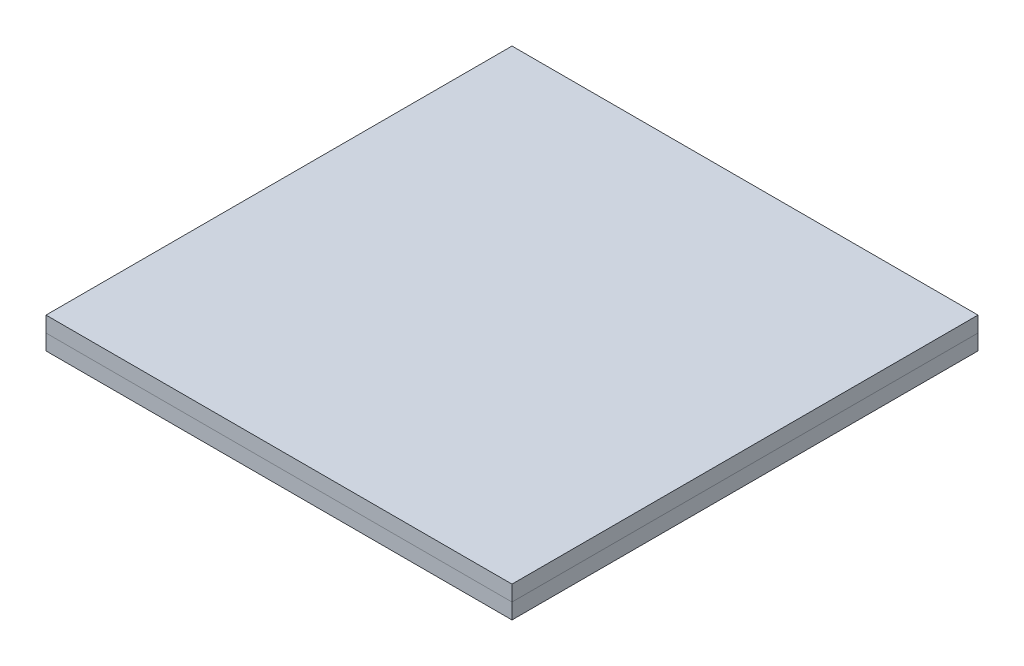
ISO-10303-21;
HEADER;
FILE_DESCRIPTION(('STEP AP214'),'2;1');
FILE_NAME('part.step','',(''),(''),'','','');
FILE_SCHEMA(('AUTOMOTIVE_DESIGN { 1 0 10303 214 1 1 1 1 }'));
ENDSEC;
DATA;
#1=APPLICATION_CONTEXT('core data for automotive mechanical design processes');
#2=APPLICATION_PROTOCOL_DEFINITION('international standard','automotive_design',2000,#1);
#3=PRODUCT_CONTEXT('',#1,'mechanical');
#4=PRODUCT('Part','Part','',(#3));
#5=PRODUCT_RELATED_PRODUCT_CATEGORY('part','',(#4));
#6=PRODUCT_DEFINITION_FORMATION('','',#4);
#7=PRODUCT_DEFINITION_CONTEXT('part definition',#1,'design');
#8=PRODUCT_DEFINITION('design','',#6,#7);
#9=PRODUCT_DEFINITION_SHAPE('','',#8);
#10=(LENGTH_UNIT() NAMED_UNIT(*) SI_UNIT(.MILLI.,.METRE.));
#11=(NAMED_UNIT(*) PLANE_ANGLE_UNIT() SI_UNIT($,.RADIAN.));
#12=(NAMED_UNIT(*) SI_UNIT($,.STERADIAN.) SOLID_ANGLE_UNIT());
#13=UNCERTAINTY_MEASURE_WITH_UNIT(LENGTH_MEASURE(1.E-05),#10,'distance_accuracy_value','');
#14=(GEOMETRIC_REPRESENTATION_CONTEXT(3) GLOBAL_UNCERTAINTY_ASSIGNED_CONTEXT((#13)) GLOBAL_UNIT_ASSIGNED_CONTEXT((#10,
#11,#12)) REPRESENTATION_CONTEXT('',''));
#15=CARTESIAN_POINT('',(0.,0.,0.));
#16=DIRECTION('',(0.,0.,1.));
#17=DIRECTION('',(1.,0.,0.));
#18=AXIS2_PLACEMENT_3D('',#15,#16,#17);
#19=CARTESIAN_POINT('',(0.,1.27,0.));
#20=DIRECTION('',(0.,-1.,0.));
#21=DIRECTION('',(0.,0.,-1.));
#22=AXIS2_PLACEMENT_3D('',#19,#20,#21);
#23=PLANE('',#22);
#24=DIRECTION('',(1.,0.,0.));
#25=VECTOR('',#24,1.);
#26=CARTESIAN_POINT('',(-19.05,1.27,-19.05));
#27=LINE('',#26,#25);
#28=CARTESIAN_POINT('',(-19.05,1.27,-19.05));
#29=VERTEX_POINT('',#28);
#30=CARTESIAN_POINT('',(19.05,1.27,-19.05));
#31=VERTEX_POINT('',#30);
#32=EDGE_CURVE('E113',#29,#31,#27,.T.);
#33=ORIENTED_EDGE('',*,*,#32,.T.);
#34=DIRECTION('',(0.,0.,1.));
#35=VECTOR('',#34,1.);
#36=CARTESIAN_POINT('',(19.05,1.27,19.05));
#37=LINE('',#36,#35);
#38=CARTESIAN_POINT('',(19.05,1.27,19.05));
#39=VERTEX_POINT('',#38);
#40=EDGE_CURVE('E100',#31,#39,#37,.T.);
#41=ORIENTED_EDGE('',*,*,#40,.T.);
#42=DIRECTION('',(-1.,0.,0.));
#43=VECTOR('',#42,1.);
#44=CARTESIAN_POINT('',(-19.05,1.27,19.05));
#45=LINE('',#44,#43);
#46=CARTESIAN_POINT('',(-19.05,1.27,19.05));
#47=VERTEX_POINT('',#46);
#48=EDGE_CURVE('E111',#39,#47,#45,.T.);
#49=ORIENTED_EDGE('',*,*,#48,.T.);
#50=DIRECTION('',(0.,0.,-1.));
#51=VECTOR('',#50,1.);
#52=CARTESIAN_POINT('',(-19.05,1.27,19.05));
#53=LINE('',#52,#51);
#54=EDGE_CURVE('E120',#47,#29,#53,.T.);
#55=ORIENTED_EDGE('',*,*,#54,.T.);
#56=EDGE_LOOP('',(#33,#41,#49,#55));
#57=FACE_BOUND('',#56,.T.);
#58=ADVANCED_FACE('F57',(#57),#23,.T.);
#59=CARTESIAN_POINT('',(19.05,2.54,19.05));
#60=DIRECTION('',(-1.,0.,0.));
#61=DIRECTION('',(0.,0.,1.));
#62=AXIS2_PLACEMENT_3D('',#59,#60,#61);
#63=PLANE('',#62);
#64=ORIENTED_EDGE('',*,*,#40,.F.);
#65=DIRECTION('',(0.,-1.,0.));
#66=VECTOR('',#65,1.);
#67=CARTESIAN_POINT('',(19.05,2.54,-19.05));
#68=LINE('',#67,#66);
#69=CARTESIAN_POINT('',(19.05,2.54,-19.05));
#70=VERTEX_POINT('',#69);
#71=EDGE_CURVE('E115',#70,#31,#68,.T.);
#72=ORIENTED_EDGE('',*,*,#71,.F.);
#73=DIRECTION('',(0.,0.,-1.));
#74=VECTOR('',#73,1.);
#75=CARTESIAN_POINT('',(19.05,2.54,19.05));
#76=LINE('',#75,#74);
#77=CARTESIAN_POINT('',(19.05,2.54,19.05));
#78=VERTEX_POINT('',#77);
#79=EDGE_CURVE('E12',#78,#70,#76,.T.);
#80=ORIENTED_EDGE('',*,*,#79,.F.);
#81=DIRECTION('',(0.,-1.,0.));
#82=VECTOR('',#81,1.);
#83=CARTESIAN_POINT('',(19.05,2.54,19.05));
#84=LINE('',#83,#82);
#85=EDGE_CURVE('E61',#78,#39,#84,.T.);
#86=ORIENTED_EDGE('',*,*,#85,.T.);
#87=EDGE_LOOP('',(#64,#72,#80,#86));
#88=FACE_BOUND('',#87,.T.);
#89=ADVANCED_FACE('F98',(#88),#63,.F.);
#90=CARTESIAN_POINT('',(-19.05,2.54,-19.05));
#91=DIRECTION('',(0.,0.,1.));
#92=DIRECTION('',(1.,0.,0.));
#93=AXIS2_PLACEMENT_3D('',#90,#91,#92);
#94=PLANE('',#93);
#95=ORIENTED_EDGE('',*,*,#32,.F.);
#96=DIRECTION('',(0.,-1.,0.));
#97=VECTOR('',#96,1.);
#98=CARTESIAN_POINT('',(-19.05,2.54,-19.05));
#99=LINE('',#98,#97);
#100=CARTESIAN_POINT('',(-19.05,2.54,-19.05));
#101=VERTEX_POINT('',#100);
#102=EDGE_CURVE('E128',#101,#29,#99,.T.);
#103=ORIENTED_EDGE('',*,*,#102,.F.);
#104=DIRECTION('',(-1.,0.,0.));
#105=VECTOR('',#104,1.);
#106=CARTESIAN_POINT('',(-19.05,2.54,-19.05));
#107=LINE('',#106,#105);
#108=EDGE_CURVE('E67',#70,#101,#107,.T.);
#109=ORIENTED_EDGE('',*,*,#108,.F.);
#110=ORIENTED_EDGE('',*,*,#71,.T.);
#111=EDGE_LOOP('',(#95,#103,#109,#110));
#112=FACE_BOUND('',#111,.T.);
#113=ADVANCED_FACE('F143',(#112),#94,.F.);
#114=CARTESIAN_POINT('',(-19.05,2.54,19.05));
#115=DIRECTION('',(1.,0.,0.));
#116=DIRECTION('',(0.,0.,-1.));
#117=AXIS2_PLACEMENT_3D('',#114,#115,#116);
#118=PLANE('',#117);
#119=ORIENTED_EDGE('',*,*,#54,.F.);
#120=DIRECTION('',(0.,-1.,0.));
#121=VECTOR('',#120,1.);
#122=CARTESIAN_POINT('',(-19.05,2.54,19.05));
#123=LINE('',#122,#121);
#124=CARTESIAN_POINT('',(-19.05,2.54,19.05));
#125=VERTEX_POINT('',#124);
#126=EDGE_CURVE('E107',#125,#47,#123,.T.);
#127=ORIENTED_EDGE('',*,*,#126,.F.);
#128=DIRECTION('',(0.,0.,1.));
#129=VECTOR('',#128,1.);
#130=CARTESIAN_POINT('',(-19.05,2.54,19.05));
#131=LINE('',#130,#129);
#132=EDGE_CURVE('E136',#101,#125,#131,.T.);
#133=ORIENTED_EDGE('',*,*,#132,.F.);
#134=ORIENTED_EDGE('',*,*,#102,.T.);
#135=EDGE_LOOP('',(#119,#127,#133,#134));
#136=FACE_BOUND('',#135,.T.);
#137=ADVANCED_FACE('F142',(#136),#118,.F.);
#138=CARTESIAN_POINT('',(-19.05,2.54,19.05));
#139=DIRECTION('',(0.,0.,-1.));
#140=DIRECTION('',(-1.,0.,0.));
#141=AXIS2_PLACEMENT_3D('',#138,#139,#140);
#142=PLANE('',#141);
#143=ORIENTED_EDGE('',*,*,#48,.F.);
#144=ORIENTED_EDGE('',*,*,#85,.F.);
#145=DIRECTION('',(1.,0.,0.));
#146=VECTOR('',#145,1.);
#147=CARTESIAN_POINT('',(-19.05,2.54,19.05));
#148=LINE('',#147,#146);
#149=EDGE_CURVE('E106',#125,#78,#148,.T.);
#150=ORIENTED_EDGE('',*,*,#149,.F.);
#151=ORIENTED_EDGE('',*,*,#126,.T.);
#152=EDGE_LOOP('',(#143,#144,#150,#151));
#153=FACE_BOUND('',#152,.T.);
#154=ADVANCED_FACE('F59',(#153),#142,.F.);
#155=CARTESIAN_POINT('',(0.,2.54,0.));
#156=DIRECTION('',(0.,-1.,0.));
#157=DIRECTION('',(0.,0.,-1.));
#158=AXIS2_PLACEMENT_3D('',#155,#156,#157);
#159=PLANE('',#158);
#160=ORIENTED_EDGE('',*,*,#79,.T.);
#161=ORIENTED_EDGE('',*,*,#108,.T.);
#162=ORIENTED_EDGE('',*,*,#132,.T.);
#163=ORIENTED_EDGE('',*,*,#149,.T.);
#164=EDGE_LOOP('',(#160,#161,#162,#163));
#165=FACE_BOUND('',#164,.T.);
#166=ADVANCED_FACE('F139',(#165),#159,.F.);
#167=CLOSED_SHELL('',(#58,#89,#113,#137,#154,#166));
#168=MANIFOLD_SOLID_BREP('B2',#167);
#169=CARTESIAN_POINT('',(0.,1.27,0.));
#170=DIRECTION('',(0.,-1.,0.));
#171=DIRECTION('',(0.,0.,-1.));
#172=AXIS2_PLACEMENT_3D('',#169,#170,#171);
#173=PLANE('',#172);
#174=DIRECTION('',(1.,0.,0.));
#175=VECTOR('',#174,1.);
#176=CARTESIAN_POINT('',(-19.05,1.27,-19.05));
#177=LINE('',#176,#175);
#178=CARTESIAN_POINT('',(-19.05,1.27,-19.05));
#179=VERTEX_POINT('',#178);
#180=CARTESIAN_POINT('',(19.05,1.27,-19.05));
#181=VERTEX_POINT('',#180);
#182=EDGE_CURVE('E219',#179,#181,#177,.T.);
#183=ORIENTED_EDGE('',*,*,#182,.F.);
#184=DIRECTION('',(0.,0.,-1.));
#185=VECTOR('',#184,1.);
#186=CARTESIAN_POINT('',(-19.05,1.27,19.05));
#187=LINE('',#186,#185);
#188=CARTESIAN_POINT('',(-19.05,1.27,19.05));
#189=VERTEX_POINT('',#188);
#190=EDGE_CURVE('E232',#189,#179,#187,.T.);
#191=ORIENTED_EDGE('',*,*,#190,.F.);
#192=DIRECTION('',(-1.,0.,0.));
#193=VECTOR('',#192,1.);
#194=CARTESIAN_POINT('',(-19.05,1.27,19.05));
#195=LINE('',#194,#193);
#196=CARTESIAN_POINT('',(19.05,1.27,19.05));
#197=VERTEX_POINT('',#196);
#198=EDGE_CURVE('E259',#197,#189,#195,.T.);
#199=ORIENTED_EDGE('',*,*,#198,.F.);
#200=DIRECTION('',(0.,0.,1.));
#201=VECTOR('',#200,1.);
#202=CARTESIAN_POINT('',(19.05,1.27,19.05));
#203=LINE('',#202,#201);
#204=EDGE_CURVE('E55',#181,#197,#203,.T.);
#205=ORIENTED_EDGE('',*,*,#204,.F.);
#206=EDGE_LOOP('',(#183,#191,#199,#205));
#207=FACE_BOUND('',#206,.T.);
#208=ADVANCED_FACE('F212',(#207),#173,.F.);
#209=CARTESIAN_POINT('',(-19.05,2.54,-19.05));
#210=DIRECTION('',(0.,0.,1.));
#211=DIRECTION('',(1.,0.,0.));
#212=AXIS2_PLACEMENT_3D('',#209,#210,#211);
#213=PLANE('',#212);
#214=DIRECTION('',(0.,-1.,0.));
#215=VECTOR('',#214,1.);
#216=CARTESIAN_POINT('',(-19.05,2.54,-19.05));
#217=LINE('',#216,#215);
#218=CARTESIAN_POINT('',(-19.05,0.,-19.05));
#219=VERTEX_POINT('',#218);
#220=EDGE_CURVE('E260',#179,#219,#217,.T.);
#221=ORIENTED_EDGE('',*,*,#220,.F.);
#222=ORIENTED_EDGE('',*,*,#182,.T.);
#223=DIRECTION('',(0.,-1.,0.));
#224=VECTOR('',#223,1.);
#225=CARTESIAN_POINT('',(19.05,2.54,-19.05));
#226=LINE('',#225,#224);
#227=CARTESIAN_POINT('',(19.05,0.,-19.05));
#228=VERTEX_POINT('',#227);
#229=EDGE_CURVE('E251',#181,#228,#226,.T.);
#230=ORIENTED_EDGE('',*,*,#229,.T.);
#231=DIRECTION('',(-1.,0.,0.));
#232=VECTOR('',#231,1.);
#233=CARTESIAN_POINT('',(-19.05,0.,-19.05));
#234=LINE('',#233,#232);
#235=EDGE_CURVE('E255',#228,#219,#234,.T.);
#236=ORIENTED_EDGE('',*,*,#235,.T.);
#237=EDGE_LOOP('',(#221,#222,#230,#236));
#238=FACE_BOUND('',#237,.T.);
#239=ADVANCED_FACE('F254',(#238),#213,.F.);
#240=CARTESIAN_POINT('',(0.,0.,0.));
#241=DIRECTION('',(0.,-1.,0.));
#242=DIRECTION('',(0.,0.,-1.));
#243=AXIS2_PLACEMENT_3D('',#240,#241,#242);
#244=PLANE('',#243);
#245=DIRECTION('',(0.,0.,-1.));
#246=VECTOR('',#245,1.);
#247=CARTESIAN_POINT('',(19.05,0.,19.05));
#248=LINE('',#247,#246);
#249=CARTESIAN_POINT('',(19.05,0.,19.05));
#250=VERTEX_POINT('',#249);
#251=EDGE_CURVE('E266',#250,#228,#248,.T.);
#252=ORIENTED_EDGE('',*,*,#251,.F.);
#253=DIRECTION('',(1.,0.,0.));
#254=VECTOR('',#253,1.);
#255=CARTESIAN_POINT('',(-19.05,0.,19.05));
#256=LINE('',#255,#254);
#257=CARTESIAN_POINT('',(-19.05,0.,19.05));
#258=VERTEX_POINT('',#257);
#259=EDGE_CURVE('E277',#258,#250,#256,.T.);
#260=ORIENTED_EDGE('',*,*,#259,.F.);
#261=DIRECTION('',(0.,0.,1.));
#262=VECTOR('',#261,1.);
#263=CARTESIAN_POINT('',(-19.05,0.,19.05));
#264=LINE('',#263,#262);
#265=EDGE_CURVE('E268',#219,#258,#264,.T.);
#266=ORIENTED_EDGE('',*,*,#265,.F.);
#267=ORIENTED_EDGE('',*,*,#235,.F.);
#268=EDGE_LOOP('',(#252,#260,#266,#267));
#269=FACE_BOUND('',#268,.T.);
#270=ADVANCED_FACE('F264',(#269),#244,.T.);
#271=CARTESIAN_POINT('',(-19.05,2.54,19.05));
#272=DIRECTION('',(1.,0.,0.));
#273=DIRECTION('',(0.,0.,-1.));
#274=AXIS2_PLACEMENT_3D('',#271,#272,#273);
#275=PLANE('',#274);
#276=DIRECTION('',(0.,-1.,0.));
#277=VECTOR('',#276,1.);
#278=CARTESIAN_POINT('',(-19.05,2.54,19.05));
#279=LINE('',#278,#277);
#280=EDGE_CURVE('E280',#189,#258,#279,.T.);
#281=ORIENTED_EDGE('',*,*,#280,.F.);
#282=ORIENTED_EDGE('',*,*,#190,.T.);
#283=ORIENTED_EDGE('',*,*,#220,.T.);
#284=ORIENTED_EDGE('',*,*,#265,.T.);
#285=EDGE_LOOP('',(#281,#282,#283,#284));
#286=FACE_BOUND('',#285,.T.);
#287=ADVANCED_FACE('F286',(#286),#275,.F.);
#288=CARTESIAN_POINT('',(19.05,2.54,19.05));
#289=DIRECTION('',(-1.,0.,0.));
#290=DIRECTION('',(0.,0.,1.));
#291=AXIS2_PLACEMENT_3D('',#288,#289,#290);
#292=PLANE('',#291);
#293=ORIENTED_EDGE('',*,*,#229,.F.);
#294=ORIENTED_EDGE('',*,*,#204,.T.);
#295=DIRECTION('',(0.,-1.,0.));
#296=VECTOR('',#295,1.);
#297=CARTESIAN_POINT('',(19.05,2.54,19.05));
#298=LINE('',#297,#296);
#299=EDGE_CURVE('E272',#197,#250,#298,.T.);
#300=ORIENTED_EDGE('',*,*,#299,.T.);
#301=ORIENTED_EDGE('',*,*,#251,.T.);
#302=EDGE_LOOP('',(#293,#294,#300,#301));
#303=FACE_BOUND('',#302,.T.);
#304=ADVANCED_FACE('F270',(#303),#292,.F.);
#305=CARTESIAN_POINT('',(-19.05,2.54,19.05));
#306=DIRECTION('',(0.,0.,-1.));
#307=DIRECTION('',(-1.,0.,0.));
#308=AXIS2_PLACEMENT_3D('',#305,#306,#307);
#309=PLANE('',#308);
#310=ORIENTED_EDGE('',*,*,#299,.F.);
#311=ORIENTED_EDGE('',*,*,#198,.T.);
#312=ORIENTED_EDGE('',*,*,#280,.T.);
#313=ORIENTED_EDGE('',*,*,#259,.T.);
#314=EDGE_LOOP('',(#310,#311,#312,#313));
#315=FACE_BOUND('',#314,.T.);
#316=ADVANCED_FACE('F285',(#315),#309,.F.);
#317=CLOSED_SHELL('',(#208,#239,#270,#287,#304,#316));
#318=MANIFOLD_SOLID_BREP('B6',#317);
#319=ADVANCED_BREP_SHAPE_REPRESENTATION('',(#18,#168,#318),#14);
#320=SHAPE_DEFINITION_REPRESENTATION(#9,#319);
ENDSEC;
END-ISO-10303-21;
